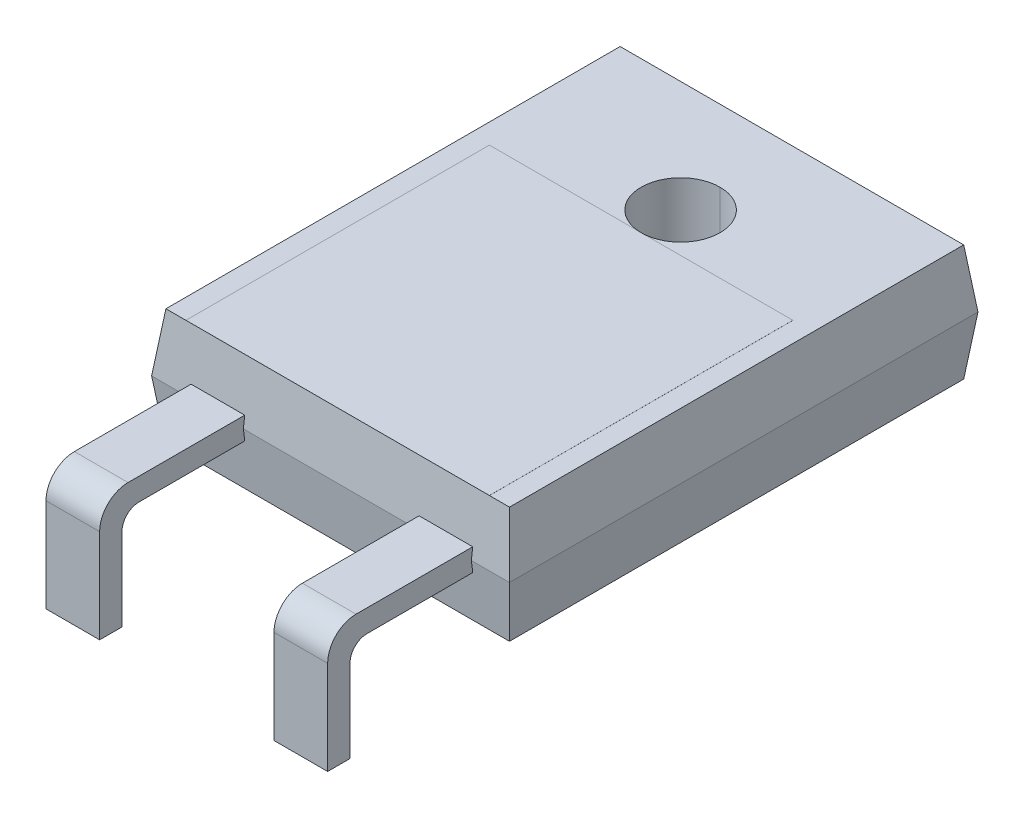
ISO-10303-21;
HEADER;
FILE_DESCRIPTION(('STEP AP214'),'2;1');
FILE_NAME('part.step','',(''),(''),'','','');
FILE_SCHEMA(('AUTOMOTIVE_DESIGN { 1 0 10303 214 1 1 1 1 }'));
ENDSEC;
DATA;
#1=APPLICATION_CONTEXT('core data for automotive mechanical design processes');
#2=APPLICATION_PROTOCOL_DEFINITION('international standard','automotive_design',2000,#1);
#3=PRODUCT_CONTEXT('',#1,'mechanical');
#4=PRODUCT('Part','Part','',(#3));
#5=PRODUCT_RELATED_PRODUCT_CATEGORY('part','',(#4));
#6=PRODUCT_DEFINITION_FORMATION('','',#4);
#7=PRODUCT_DEFINITION_CONTEXT('part definition',#1,'design');
#8=PRODUCT_DEFINITION('design','',#6,#7);
#9=PRODUCT_DEFINITION_SHAPE('','',#8);
#10=(LENGTH_UNIT() NAMED_UNIT(*) SI_UNIT(.MILLI.,.METRE.));
#11=(NAMED_UNIT(*) PLANE_ANGLE_UNIT() SI_UNIT($,.RADIAN.));
#12=(NAMED_UNIT(*) SI_UNIT($,.STERADIAN.) SOLID_ANGLE_UNIT());
#13=UNCERTAINTY_MEASURE_WITH_UNIT(LENGTH_MEASURE(1.E-05),#10,'distance_accuracy_value','');
#14=(GEOMETRIC_REPRESENTATION_CONTEXT(3) GLOBAL_UNCERTAINTY_ASSIGNED_CONTEXT((#13)) GLOBAL_UNIT_ASSIGNED_CONTEXT((#10,
#11,#12)) REPRESENTATION_CONTEXT('',''));
#15=CARTESIAN_POINT('',(0.,0.,0.));
#16=DIRECTION('',(0.,0.,1.));
#17=DIRECTION('',(1.,0.,0.));
#18=AXIS2_PLACEMENT_3D('',#15,#16,#17);
#19=CARTESIAN_POINT('',(0.,2.60254,0.));
#20=DIRECTION('',(0.,-1.,0.));
#21=DIRECTION('',(0.,0.,-1.));
#22=AXIS2_PLACEMENT_3D('',#19,#20,#21);
#23=PLANE('',#22);
#24=DIRECTION('',(0.,0.,-1.));
#25=VECTOR('',#24,1.);
#26=CARTESIAN_POINT('',(6.787880070826,2.60254,10.160760141652));
#27=LINE('',#26,#25);
#28=CARTESIAN_POINT('',(6.787880070826,2.60254,10.160760141652));
#29=VERTEX_POINT('',#28);
#30=CARTESIAN_POINT('',(6.787880070826,2.60254,-3.415));
#31=VERTEX_POINT('',#30);
#32=EDGE_CURVE('E329',#29,#31,#27,.T.);
#33=ORIENTED_EDGE('',*,*,#32,.T.);
#34=DIRECTION('',(-1.,0.,0.));
#35=VECTOR('',#34,1.);
#36=CARTESIAN_POINT('',(-6.787880070826,2.60254,-3.415));
#37=LINE('',#36,#35);
#38=CARTESIAN_POINT('',(-6.787880070826,2.60254,-3.415));
#39=VERTEX_POINT('',#38);
#40=EDGE_CURVE('E290',#31,#39,#37,.T.);
#41=ORIENTED_EDGE('',*,*,#40,.T.);
#42=DIRECTION('',(0.,0.,1.));
#43=VECTOR('',#42,1.);
#44=CARTESIAN_POINT('',(-6.787880070826,2.60254,10.160760141652));
#45=LINE('',#44,#43);
#46=CARTESIAN_POINT('',(-6.787880070826,2.60254,10.160760141652));
#47=VERTEX_POINT('',#46);
#48=EDGE_CURVE('E27',#39,#47,#45,.T.);
#49=ORIENTED_EDGE('',*,*,#48,.T.);
#50=DIRECTION('',(1.,0.,0.));
#51=VECTOR('',#50,1.);
#52=CARTESIAN_POINT('',(-6.787880070826,2.60254,10.160760141652));
#53=LINE('',#52,#51);
#54=EDGE_CURVE('E11',#47,#29,#53,.T.);
#55=ORIENTED_EDGE('',*,*,#54,.T.);
#56=EDGE_LOOP('',(#33,#41,#49,#55));
#57=FACE_BOUND('',#56,.T.);
#58=ADVANCED_FACE('F16',(#57),#23,.F.);
#59=CARTESIAN_POINT('',(-6.787880070826,2.60254,10.160760141652));
#60=DIRECTION('',(0.,0.,-1.));
#61=DIRECTION('',(0.,-1.,0.));
#62=AXIS2_PLACEMENT_3D('',#59,#60,#61);
#63=PLANE('',#62);
#64=DIRECTION('',(1.,0.,0.));
#65=VECTOR('',#64,1.);
#66=CARTESIAN_POINT('',(-6.787880070826,2.6,10.160760141652));
#67=LINE('',#66,#65);
#68=CARTESIAN_POINT('',(-6.787880070826,2.6,10.160760141652));
#69=VERTEX_POINT('',#68);
#70=CARTESIAN_POINT('',(6.787880070826,2.6,10.160760141652));
#71=VERTEX_POINT('',#70);
#72=EDGE_CURVE('E20',#69,#71,#67,.T.);
#73=ORIENTED_EDGE('',*,*,#72,.T.);
#74=DIRECTION('',(0.,-1.,0.));
#75=VECTOR('',#74,1.);
#76=CARTESIAN_POINT('',(6.787880070826,2.60254,10.160760141652));
#77=LINE('',#76,#75);
#78=EDGE_CURVE('E326',#29,#71,#77,.T.);
#79=ORIENTED_EDGE('',*,*,#78,.F.);
#80=ORIENTED_EDGE('',*,*,#54,.F.);
#81=DIRECTION('',(0.,-1.,0.));
#82=VECTOR('',#81,1.);
#83=CARTESIAN_POINT('',(-6.787880070826,2.60254,10.160760141652));
#84=LINE('',#83,#82);
#85=EDGE_CURVE('E294',#47,#69,#84,.T.);
#86=ORIENTED_EDGE('',*,*,#85,.T.);
#87=EDGE_LOOP('',(#73,#79,#80,#86));
#88=FACE_BOUND('',#87,.T.);
#89=ADVANCED_FACE('F560',(#88),#63,.F.);
#90=CARTESIAN_POINT('',(-6.787880070826,2.60254,10.160760141652));
#91=DIRECTION('',(1.,0.,0.));
#92=DIRECTION('',(0.,1.,0.));
#93=AXIS2_PLACEMENT_3D('',#90,#91,#92);
#94=PLANE('',#93);
#95=DIRECTION('',(0.,0.,1.));
#96=VECTOR('',#95,1.);
#97=CARTESIAN_POINT('',(-6.787880070826,2.6,10.160760141652));
#98=LINE('',#97,#96);
#99=CARTESIAN_POINT('',(-6.787880070826,2.6,-3.415));
#100=VERTEX_POINT('',#99);
#101=EDGE_CURVE('E300',#100,#69,#98,.T.);
#102=ORIENTED_EDGE('',*,*,#101,.T.);
#103=ORIENTED_EDGE('',*,*,#85,.F.);
#104=ORIENTED_EDGE('',*,*,#48,.F.);
#105=DIRECTION('',(0.,-1.,0.));
#106=VECTOR('',#105,1.);
#107=CARTESIAN_POINT('',(-6.787880070826,2.60254,-3.415));
#108=LINE('',#107,#106);
#109=EDGE_CURVE('E295',#39,#100,#108,.T.);
#110=ORIENTED_EDGE('',*,*,#109,.T.);
#111=EDGE_LOOP('',(#102,#103,#104,#110));
#112=FACE_BOUND('',#111,.T.);
#113=ADVANCED_FACE('F568',(#112),#94,.F.);
#114=CARTESIAN_POINT('',(-6.787880070826,2.60254,-3.415));
#115=DIRECTION('',(0.,0.,1.));
#116=DIRECTION('',(1.,0.,0.));
#117=AXIS2_PLACEMENT_3D('',#114,#115,#116);
#118=PLANE('',#117);
#119=DIRECTION('',(-1.,0.,0.));
#120=VECTOR('',#119,1.);
#121=CARTESIAN_POINT('',(-6.787880070826,2.6,-3.415));
#122=LINE('',#121,#120);
#123=CARTESIAN_POINT('',(6.787880070826,2.6,-3.415));
#124=VERTEX_POINT('',#123);
#125=CARTESIAN_POINT('',(0.,2.6,-3.415));
#126=VERTEX_POINT('',#125);
#127=EDGE_CURVE('E387',#124,#126,#122,.T.);
#128=ORIENTED_EDGE('',*,*,#127,.T.);
#129=DIRECTION('',(-1.,0.,0.));
#130=VECTOR('',#129,1.);
#131=CARTESIAN_POINT('',(-6.787880070826,2.6,-3.415));
#132=LINE('',#131,#130);
#133=EDGE_CURVE('E386',#126,#100,#132,.T.);
#134=ORIENTED_EDGE('',*,*,#133,.T.);
#135=ORIENTED_EDGE('',*,*,#109,.F.);
#136=ORIENTED_EDGE('',*,*,#40,.F.);
#137=DIRECTION('',(0.,-1.,0.));
#138=VECTOR('',#137,1.);
#139=CARTESIAN_POINT('',(6.787880070826,2.60254,-3.415));
#140=LINE('',#139,#138);
#141=EDGE_CURVE('E392',#31,#124,#140,.T.);
#142=ORIENTED_EDGE('',*,*,#141,.T.);
#143=EDGE_LOOP('',(#128,#134,#135,#136,#142));
#144=FACE_BOUND('',#143,.T.);
#145=ADVANCED_FACE('F747',(#144),#118,.F.);
#146=CARTESIAN_POINT('',(6.787880070826,2.60254,10.160760141652));
#147=DIRECTION('',(-1.,0.,0.));
#148=DIRECTION('',(0.,0.,1.));
#149=AXIS2_PLACEMENT_3D('',#146,#147,#148);
#150=PLANE('',#149);
#151=DIRECTION('',(0.,0.,-1.));
#152=VECTOR('',#151,1.);
#153=CARTESIAN_POINT('',(6.787880070826,2.6,10.160760141652));
#154=LINE('',#153,#152);
#155=EDGE_CURVE('E378',#71,#124,#154,.T.);
#156=ORIENTED_EDGE('',*,*,#155,.T.);
#157=ORIENTED_EDGE('',*,*,#141,.F.);
#158=ORIENTED_EDGE('',*,*,#32,.F.);
#159=ORIENTED_EDGE('',*,*,#78,.T.);
#160=EDGE_LOOP('',(#156,#157,#158,#159));
#161=FACE_BOUND('',#160,.T.);
#162=ADVANCED_FACE('F758',(#161),#150,.F.);
#163=CARTESIAN_POINT('',(-6.29999996,-0.77,15.64));
#164=DIRECTION('',(-1.,0.,0.));
#165=DIRECTION('',(0.,0.,1.));
#166=AXIS2_PLACEMENT_3D('',#163,#164,#165);
#167=PLANE('',#166);
#168=DIRECTION('',(0.,0.992546151641335,-0.121869343405041));
#169=VECTOR('',#168,1.);
#170=CARTESIAN_POINT('',(-6.29999996,0.,10.48));
#171=LINE('',#170,#169);
#172=CARTESIAN_POINT('',(-6.29999996,0.,10.48));
#173=VERTEX_POINT('',#172);
#174=CARTESIAN_POINT('',(-6.29999996,0.5,10.418607719549));
#175=VERTEX_POINT('',#174);
#176=EDGE_CURVE('E355',#173,#175,#171,.T.);
#177=ORIENTED_EDGE('',*,*,#176,.F.);
#178=DIRECTION('',(0.,-0.992546151641335,-0.121869343405041));
#179=VECTOR('',#178,1.);
#180=CARTESIAN_POINT('',(-6.29999996,0.,10.48));
#181=LINE('',#180,#179);
#182=CARTESIAN_POINT('',(-6.29999996,-0.5,10.418607719549));
#183=VERTEX_POINT('',#182);
#184=EDGE_CURVE('E441',#173,#183,#181,.T.);
#185=ORIENTED_EDGE('',*,*,#184,.T.);
#186=DIRECTION('',(0.,0.,-1.));
#187=VECTOR('',#186,1.);
#188=CARTESIAN_POINT('',(-6.29999996,-0.5,15.148));
#189=LINE('',#188,#187);
#190=CARTESIAN_POINT('',(-6.29999996,-0.5,15.148));
#191=VERTEX_POINT('',#190);
#192=EDGE_CURVE('E342',#191,#183,#189,.T.);
#193=ORIENTED_EDGE('',*,*,#192,.F.);
#194=CARTESIAN_POINT('',(-6.29999996,-1.262,15.148));
#195=DIRECTION('',(-1.,0.,0.));
#196=DIRECTION('',(0.,0.,1.));
#197=AXIS2_PLACEMENT_3D('',#194,#195,#196);
#198=CIRCLE('',#197,0.762);
#199=CARTESIAN_POINT('',(-6.29999996,-1.262,15.91));
#200=VERTEX_POINT('',#199);
#201=EDGE_CURVE('E373',#200,#191,#198,.T.);
#202=ORIENTED_EDGE('',*,*,#201,.F.);
#203=DIRECTION('',(0.,1.,0.));
#204=VECTOR('',#203,1.);
#205=CARTESIAN_POINT('',(-6.29999996,-4.961,15.91));
#206=LINE('',#205,#204);
#207=CARTESIAN_POINT('',(-6.29999996,-4.961,15.91));
#208=VERTEX_POINT('',#207);
#209=EDGE_CURVE('E532',#208,#200,#206,.T.);
#210=ORIENTED_EDGE('',*,*,#209,.F.);
#211=DIRECTION('',(0.,0.,-1.));
#212=VECTOR('',#211,1.);
#213=CARTESIAN_POINT('',(-6.29999996,-4.961,16.91));
#214=LINE('',#213,#212);
#215=CARTESIAN_POINT('',(-6.29999996,-4.961,16.91));
#216=VERTEX_POINT('',#215);
#217=EDGE_CURVE('E474',#216,#208,#214,.T.);
#218=ORIENTED_EDGE('',*,*,#217,.F.);
#219=DIRECTION('',(0.,-1.,0.));
#220=VECTOR('',#219,1.);
#221=CARTESIAN_POINT('',(-6.29999996,-0.77,16.91));
#222=LINE('',#221,#220);
#223=CARTESIAN_POINT('',(-6.29999996,-0.77,16.91));
#224=VERTEX_POINT('',#223);
#225=EDGE_CURVE('E353',#224,#216,#222,.T.);
#226=ORIENTED_EDGE('',*,*,#225,.F.);
#227=CARTESIAN_POINT('',(-6.29999996,-0.77,15.64));
#228=DIRECTION('',(1.,0.,0.));
#229=DIRECTION('',(0.,0.,-1.));
#230=AXIS2_PLACEMENT_3D('',#227,#228,#229);
#231=CIRCLE('',#230,1.27);
#232=CARTESIAN_POINT('',(-6.29999996,0.5,15.64));
#233=VERTEX_POINT('',#232);
#234=EDGE_CURVE('E288',#233,#224,#231,.T.);
#235=ORIENTED_EDGE('',*,*,#234,.F.);
#236=DIRECTION('',(0.,0.,1.));
#237=VECTOR('',#236,1.);
#238=CARTESIAN_POINT('',(-6.29999996,0.5,10.226));
#239=LINE('',#238,#237);
#240=EDGE_CURVE('E289',#175,#233,#239,.T.);
#241=ORIENTED_EDGE('',*,*,#240,.F.);
#242=EDGE_LOOP('',(#177,#185,#193,#202,#210,#218,#226,#235,#241));
#243=FACE_BOUND('',#242,.T.);
#244=ADVANCED_FACE('F770',(#243),#167,.T.);
#245=CARTESIAN_POINT('',(-3.89999996,-0.77,15.64));
#246=DIRECTION('',(-1.,0.,0.));
#247=DIRECTION('',(0.,0.,1.));
#248=AXIS2_PLACEMENT_3D('',#245,#246,#247);
#249=PLANE('',#248);
#250=DIRECTION('',(0.,-0.992546151641335,-0.121869343405041));
#251=VECTOR('',#250,1.);
#252=CARTESIAN_POINT('',(-3.89999996,0.,10.48));
#253=LINE('',#252,#251);
#254=CARTESIAN_POINT('',(-3.89999996,0.,10.48));
#255=VERTEX_POINT('',#254);
#256=CARTESIAN_POINT('',(-3.89999996,-0.5,10.418607719549));
#257=VERTEX_POINT('',#256);
#258=EDGE_CURVE('E483',#255,#257,#253,.T.);
#259=ORIENTED_EDGE('',*,*,#258,.F.);
#260=DIRECTION('',(0.,0.992546151641335,-0.121869343405041));
#261=VECTOR('',#260,1.);
#262=CARTESIAN_POINT('',(-3.89999996,0.,10.48));
#263=LINE('',#262,#261);
#264=CARTESIAN_POINT('',(-3.89999996,0.5,10.418607719549));
#265=VERTEX_POINT('',#264);
#266=EDGE_CURVE('E469',#255,#265,#263,.T.);
#267=ORIENTED_EDGE('',*,*,#266,.T.);
#268=DIRECTION('',(0.,0.,1.));
#269=VECTOR('',#268,1.);
#270=CARTESIAN_POINT('',(-3.89999996,0.5,10.226));
#271=LINE('',#270,#269);
#272=CARTESIAN_POINT('',(-3.89999996,0.5,15.64));
#273=VERTEX_POINT('',#272);
#274=EDGE_CURVE('E247',#265,#273,#271,.T.);
#275=ORIENTED_EDGE('',*,*,#274,.T.);
#276=CARTESIAN_POINT('',(-3.89999996,-0.77,15.64));
#277=DIRECTION('',(1.,0.,0.));
#278=DIRECTION('',(0.,0.,-1.));
#279=AXIS2_PLACEMENT_3D('',#276,#277,#278);
#280=CIRCLE('',#279,1.27);
#281=CARTESIAN_POINT('',(-3.89999996,-0.77,16.91));
#282=VERTEX_POINT('',#281);
#283=EDGE_CURVE('E349',#273,#282,#280,.T.);
#284=ORIENTED_EDGE('',*,*,#283,.T.);
#285=DIRECTION('',(0.,-1.,0.));
#286=VECTOR('',#285,1.);
#287=CARTESIAN_POINT('',(-3.89999996,-0.77,16.91));
#288=LINE('',#287,#286);
#289=CARTESIAN_POINT('',(-3.89999996,-4.961,16.91));
#290=VERTEX_POINT('',#289);
#291=EDGE_CURVE('E479',#282,#290,#288,.T.);
#292=ORIENTED_EDGE('',*,*,#291,.T.);
#293=DIRECTION('',(0.,0.,-1.));
#294=VECTOR('',#293,1.);
#295=CARTESIAN_POINT('',(-3.89999996,-4.961,16.91));
#296=LINE('',#295,#294);
#297=CARTESIAN_POINT('',(-3.89999996,-4.961,15.91));
#298=VERTEX_POINT('',#297);
#299=EDGE_CURVE('E521',#290,#298,#296,.T.);
#300=ORIENTED_EDGE('',*,*,#299,.T.);
#301=DIRECTION('',(0.,1.,0.));
#302=VECTOR('',#301,1.);
#303=CARTESIAN_POINT('',(-3.89999996,-4.961,15.91));
#304=LINE('',#303,#302);
#305=CARTESIAN_POINT('',(-3.89999996,-1.262,15.91));
#306=VERTEX_POINT('',#305);
#307=EDGE_CURVE('E369',#298,#306,#304,.T.);
#308=ORIENTED_EDGE('',*,*,#307,.T.);
#309=CARTESIAN_POINT('',(-3.89999996,-1.262,15.148));
#310=DIRECTION('',(-1.,0.,0.));
#311=DIRECTION('',(0.,0.,1.));
#312=AXIS2_PLACEMENT_3D('',#309,#310,#311);
#313=CIRCLE('',#312,0.762);
#314=CARTESIAN_POINT('',(-3.89999996,-0.5,15.148));
#315=VERTEX_POINT('',#314);
#316=EDGE_CURVE('E343',#306,#315,#313,.T.);
#317=ORIENTED_EDGE('',*,*,#316,.T.);
#318=DIRECTION('',(0.,0.,-1.));
#319=VECTOR('',#318,1.);
#320=CARTESIAN_POINT('',(-3.89999996,-0.5,15.148));
#321=LINE('',#320,#319);
#322=EDGE_CURVE('E338',#315,#257,#321,.T.);
#323=ORIENTED_EDGE('',*,*,#322,.T.);
#324=EDGE_LOOP('',(#259,#267,#275,#284,#292,#300,#308,#317,#323));
#325=FACE_BOUND('',#324,.T.);
#326=ADVANCED_FACE('F1030',(#325),#249,.F.);
#327=CARTESIAN_POINT('',(-3.89999996,-0.5,15.148));
#328=DIRECTION('',(0.,1.,0.));
#329=DIRECTION('',(1.,0.,0.));
#330=AXIS2_PLACEMENT_3D('',#327,#328,#329);
#331=PLANE('',#330);
#332=DIRECTION('',(-1.,0.,0.));
#333=VECTOR('',#332,1.);
#334=CARTESIAN_POINT('',(-8.005,-0.5,10.418607719549));
#335=LINE('',#334,#333);
#336=EDGE_CURVE('E446',#257,#183,#335,.T.);
#337=ORIENTED_EDGE('',*,*,#336,.F.);
#338=ORIENTED_EDGE('',*,*,#322,.F.);
#339=DIRECTION('',(-1.,0.,0.));
#340=VECTOR('',#339,1.);
#341=CARTESIAN_POINT('',(-3.89999996,-0.5,15.148));
#342=LINE('',#341,#340);
#343=EDGE_CURVE('E398',#315,#191,#342,.T.);
#344=ORIENTED_EDGE('',*,*,#343,.T.);
#345=ORIENTED_EDGE('',*,*,#192,.T.);
#346=EDGE_LOOP('',(#337,#338,#344,#345));
#347=FACE_BOUND('',#346,.T.);
#348=ADVANCED_FACE('F1022',(#347),#331,.F.);
#349=CARTESIAN_POINT('',(-3.89999996,-1.262,15.148));
#350=DIRECTION('',(-1.,0.,0.));
#351=DIRECTION('',(0.,0.,1.));
#352=AXIS2_PLACEMENT_3D('',#349,#350,#351);
#353=CYLINDRICAL_SURFACE('',#352,0.762);
#354=DIRECTION('',(-1.,0.,0.));
#355=VECTOR('',#354,1.);
#356=CARTESIAN_POINT('',(-3.89999996,-1.262,15.91));
#357=LINE('',#356,#355);
#358=EDGE_CURVE('E272',#306,#200,#357,.T.);
#359=ORIENTED_EDGE('',*,*,#358,.T.);
#360=ORIENTED_EDGE('',*,*,#201,.T.);
#361=ORIENTED_EDGE('',*,*,#343,.F.);
#362=ORIENTED_EDGE('',*,*,#316,.F.);
#363=EDGE_LOOP('',(#359,#360,#361,#362));
#364=FACE_BOUND('',#363,.T.);
#365=ADVANCED_FACE('F1014',(#364),#353,.F.);
#366=CARTESIAN_POINT('',(-3.89999996,-4.961,15.91));
#367=DIRECTION('',(0.,0.,1.));
#368=DIRECTION('',(1.,0.,0.));
#369=AXIS2_PLACEMENT_3D('',#366,#367,#368);
#370=PLANE('',#369);
#371=DIRECTION('',(-1.,0.,0.));
#372=VECTOR('',#371,1.);
#373=CARTESIAN_POINT('',(-3.89999996,-4.961,15.91));
#374=LINE('',#373,#372);
#375=EDGE_CURVE('E478',#298,#208,#374,.T.);
#376=ORIENTED_EDGE('',*,*,#375,.T.);
#377=ORIENTED_EDGE('',*,*,#209,.T.);
#378=ORIENTED_EDGE('',*,*,#358,.F.);
#379=ORIENTED_EDGE('',*,*,#307,.F.);
#380=EDGE_LOOP('',(#376,#377,#378,#379));
#381=FACE_BOUND('',#380,.T.);
#382=ADVANCED_FACE('F1006',(#381),#370,.F.);
#383=CARTESIAN_POINT('',(-3.89999996,-4.961,16.91));
#384=DIRECTION('',(0.,1.,0.));
#385=DIRECTION('',(1.,0.,0.));
#386=AXIS2_PLACEMENT_3D('',#383,#384,#385);
#387=PLANE('',#386);
#388=DIRECTION('',(-1.,0.,0.));
#389=VECTOR('',#388,1.);
#390=CARTESIAN_POINT('',(-3.89999996,-4.961,16.91));
#391=LINE('',#390,#389);
#392=EDGE_CURVE('E503',#290,#216,#391,.T.);
#393=ORIENTED_EDGE('',*,*,#392,.T.);
#394=ORIENTED_EDGE('',*,*,#217,.T.);
#395=ORIENTED_EDGE('',*,*,#375,.F.);
#396=ORIENTED_EDGE('',*,*,#299,.F.);
#397=EDGE_LOOP('',(#393,#394,#395,#396));
#398=FACE_BOUND('',#397,.T.);
#399=ADVANCED_FACE('F998',(#398),#387,.F.);
#400=CARTESIAN_POINT('',(-3.89999996,-0.77,16.91));
#401=DIRECTION('',(0.,0.,-1.));
#402=DIRECTION('',(0.,-1.,0.));
#403=AXIS2_PLACEMENT_3D('',#400,#401,#402);
#404=PLANE('',#403);
#405=DIRECTION('',(-1.,0.,0.));
#406=VECTOR('',#405,1.);
#407=CARTESIAN_POINT('',(-3.89999996,-0.77,16.91));
#408=LINE('',#407,#406);
#409=EDGE_CURVE('E354',#282,#224,#408,.T.);
#410=ORIENTED_EDGE('',*,*,#409,.T.);
#411=ORIENTED_EDGE('',*,*,#225,.T.);
#412=ORIENTED_EDGE('',*,*,#392,.F.);
#413=ORIENTED_EDGE('',*,*,#291,.F.);
#414=EDGE_LOOP('',(#410,#411,#412,#413));
#415=FACE_BOUND('',#414,.T.);
#416=ADVANCED_FACE('F990',(#415),#404,.F.);
#417=CARTESIAN_POINT('',(-3.89999996,-0.77,15.64));
#418=DIRECTION('',(-1.,0.,0.));
#419=DIRECTION('',(0.,0.,1.));
#420=AXIS2_PLACEMENT_3D('',#417,#418,#419);
#421=CYLINDRICAL_SURFACE('',#420,1.27);
#422=DIRECTION('',(-1.,0.,0.));
#423=VECTOR('',#422,1.);
#424=CARTESIAN_POINT('',(-3.89999996,0.5,15.64));
#425=LINE('',#424,#423);
#426=EDGE_CURVE('E284',#273,#233,#425,.T.);
#427=ORIENTED_EDGE('',*,*,#426,.T.);
#428=ORIENTED_EDGE('',*,*,#234,.T.);
#429=ORIENTED_EDGE('',*,*,#409,.F.);
#430=ORIENTED_EDGE('',*,*,#283,.F.);
#431=EDGE_LOOP('',(#427,#428,#429,#430));
#432=FACE_BOUND('',#431,.T.);
#433=ADVANCED_FACE('F982',(#432),#421,.T.);
#434=CARTESIAN_POINT('',(-3.89999996,0.5,10.226));
#435=DIRECTION('',(0.,-1.,0.));
#436=DIRECTION('',(0.,0.,-1.));
#437=AXIS2_PLACEMENT_3D('',#434,#435,#436);
#438=PLANE('',#437);
#439=ORIENTED_EDGE('',*,*,#274,.F.);
#440=DIRECTION('',(-1.,0.,0.));
#441=VECTOR('',#440,1.);
#442=CARTESIAN_POINT('',(-8.005,0.5,10.418607719549));
#443=LINE('',#442,#441);
#444=EDGE_CURVE('E278',#265,#175,#443,.T.);
#445=ORIENTED_EDGE('',*,*,#444,.T.);
#446=ORIENTED_EDGE('',*,*,#240,.T.);
#447=ORIENTED_EDGE('',*,*,#426,.F.);
#448=EDGE_LOOP('',(#439,#445,#446,#447));
#449=FACE_BOUND('',#448,.T.);
#450=ADVANCED_FACE('F975',(#449),#438,.F.);
#451=CARTESIAN_POINT('',(6.29999996,-0.77,15.64));
#452=DIRECTION('',(1.,0.,0.));
#453=DIRECTION('',(0.,1.,0.));
#454=AXIS2_PLACEMENT_3D('',#451,#452,#453);
#455=PLANE('',#454);
#456=DIRECTION('',(0.,0.,-1.));
#457=VECTOR('',#456,1.);
#458=CARTESIAN_POINT('',(6.29999996,-0.5,15.148));
#459=LINE('',#458,#457);
#460=CARTESIAN_POINT('',(6.29999996,-0.5,15.148));
#461=VERTEX_POINT('',#460);
#462=CARTESIAN_POINT('',(6.29999996,-0.5,10.418607719549));
#463=VERTEX_POINT('',#462);
#464=EDGE_CURVE('E325',#461,#463,#459,.T.);
#465=ORIENTED_EDGE('',*,*,#464,.T.);
#466=DIRECTION('',(0.,0.992546151641335,0.121869343405041));
#467=VECTOR('',#466,1.);
#468=CARTESIAN_POINT('',(6.29999996,0.,10.48));
#469=LINE('',#468,#467);
#470=CARTESIAN_POINT('',(6.29999996,0.,10.48));
#471=VERTEX_POINT('',#470);
#472=EDGE_CURVE('E364',#463,#471,#469,.T.);
#473=ORIENTED_EDGE('',*,*,#472,.T.);
#474=DIRECTION('',(0.,-0.992546151641335,0.121869343405041));
#475=VECTOR('',#474,1.);
#476=CARTESIAN_POINT('',(6.29999996,0.,10.48));
#477=LINE('',#476,#475);
#478=CARTESIAN_POINT('',(6.29999996,0.5,10.418607719549));
#479=VERTEX_POINT('',#478);
#480=EDGE_CURVE('E498',#479,#471,#477,.T.);
#481=ORIENTED_EDGE('',*,*,#480,.F.);
#482=DIRECTION('',(0.,0.,1.));
#483=VECTOR('',#482,1.);
#484=CARTESIAN_POINT('',(6.29999996,0.5,10.226));
#485=LINE('',#484,#483);
#486=CARTESIAN_POINT('',(6.29999996,0.5,15.64));
#487=VERTEX_POINT('',#486);
#488=EDGE_CURVE('E317',#479,#487,#485,.T.);
#489=ORIENTED_EDGE('',*,*,#488,.T.);
#490=CARTESIAN_POINT('',(6.29999996,-0.77,15.64));
#491=DIRECTION('',(1.,0.,0.));
#492=DIRECTION('',(0.,0.,-1.));
#493=AXIS2_PLACEMENT_3D('',#490,#491,#492);
#494=CIRCLE('',#493,1.27);
#495=CARTESIAN_POINT('',(6.29999996,-0.77,16.91));
#496=VERTEX_POINT('',#495);
#497=EDGE_CURVE('E248',#487,#496,#494,.T.);
#498=ORIENTED_EDGE('',*,*,#497,.T.);
#499=DIRECTION('',(0.,-1.,0.));
#500=VECTOR('',#499,1.);
#501=CARTESIAN_POINT('',(6.29999996,-0.77,16.91));
#502=LINE('',#501,#500);
#503=CARTESIAN_POINT('',(6.29999996,-4.961,16.91));
#504=VERTEX_POINT('',#503);
#505=EDGE_CURVE('E262',#496,#504,#502,.T.);
#506=ORIENTED_EDGE('',*,*,#505,.T.);
#507=DIRECTION('',(0.,0.,-1.));
#508=VECTOR('',#507,1.);
#509=CARTESIAN_POINT('',(6.29999996,-4.961,16.91));
#510=LINE('',#509,#508);
#511=CARTESIAN_POINT('',(6.29999996,-4.961,15.91));
#512=VERTEX_POINT('',#511);
#513=EDGE_CURVE('E382',#504,#512,#510,.T.);
#514=ORIENTED_EDGE('',*,*,#513,.T.);
#515=DIRECTION('',(0.,1.,0.));
#516=VECTOR('',#515,1.);
#517=CARTESIAN_POINT('',(6.29999996,-4.961,15.91));
#518=LINE('',#517,#516);
#519=CARTESIAN_POINT('',(6.29999996,-1.262,15.91));
#520=VERTEX_POINT('',#519);
#521=EDGE_CURVE('E282',#512,#520,#518,.T.);
#522=ORIENTED_EDGE('',*,*,#521,.T.);
#523=CARTESIAN_POINT('',(6.29999996,-1.262,15.148));
#524=DIRECTION('',(-1.,0.,0.));
#525=DIRECTION('',(0.,0.,1.));
#526=AXIS2_PLACEMENT_3D('',#523,#524,#525);
#527=CIRCLE('',#526,0.762);
#528=EDGE_CURVE('E362',#520,#461,#527,.T.);
#529=ORIENTED_EDGE('',*,*,#528,.T.);
#530=EDGE_LOOP('',(#465,#473,#481,#489,#498,#506,#514,#522,#529));
#531=FACE_BOUND('',#530,.T.);
#532=ADVANCED_FACE('F634',(#531),#455,.T.);
#533=CARTESIAN_POINT('',(3.89999996,-0.77,15.64));
#534=DIRECTION('',(1.,0.,0.));
#535=DIRECTION('',(0.,1.,0.));
#536=AXIS2_PLACEMENT_3D('',#533,#534,#535);
#537=PLANE('',#536);
#538=DIRECTION('',(0.,0.992546151641335,0.121869343405041));
#539=VECTOR('',#538,1.);
#540=CARTESIAN_POINT('',(3.89999996,0.,10.48));
#541=LINE('',#540,#539);
#542=CARTESIAN_POINT('',(3.89999996,-0.5,10.418607719549));
#543=VERTEX_POINT('',#542);
#544=CARTESIAN_POINT('',(3.89999996,0.,10.48));
#545=VERTEX_POINT('',#544);
#546=EDGE_CURVE('E440',#543,#545,#541,.T.);
#547=ORIENTED_EDGE('',*,*,#546,.F.);
#548=DIRECTION('',(0.,0.,-1.));
#549=VECTOR('',#548,1.);
#550=CARTESIAN_POINT('',(3.89999996,-0.5,15.148));
#551=LINE('',#550,#549);
#552=CARTESIAN_POINT('',(3.89999996,-0.5,15.148));
#553=VERTEX_POINT('',#552);
#554=EDGE_CURVE('E321',#553,#543,#551,.T.);
#555=ORIENTED_EDGE('',*,*,#554,.F.);
#556=CARTESIAN_POINT('',(3.89999996,-1.262,15.148));
#557=DIRECTION('',(-1.,0.,0.));
#558=DIRECTION('',(0.,0.,1.));
#559=AXIS2_PLACEMENT_3D('',#556,#557,#558);
#560=CIRCLE('',#559,0.762);
#561=CARTESIAN_POINT('',(3.89999996,-1.262,15.91));
#562=VERTEX_POINT('',#561);
#563=EDGE_CURVE('E279',#562,#553,#560,.T.);
#564=ORIENTED_EDGE('',*,*,#563,.F.);
#565=DIRECTION('',(0.,1.,0.));
#566=VECTOR('',#565,1.);
#567=CARTESIAN_POINT('',(3.89999996,-4.961,15.91));
#568=LINE('',#567,#566);
#569=CARTESIAN_POINT('',(3.89999996,-4.961,15.91));
#570=VERTEX_POINT('',#569);
#571=EDGE_CURVE('E348',#570,#562,#568,.T.);
#572=ORIENTED_EDGE('',*,*,#571,.F.);
#573=DIRECTION('',(0.,0.,-1.));
#574=VECTOR('',#573,1.);
#575=CARTESIAN_POINT('',(3.89999996,-4.961,16.91));
#576=LINE('',#575,#574);
#577=CARTESIAN_POINT('',(3.89999996,-4.961,16.91));
#578=VERTEX_POINT('',#577);
#579=EDGE_CURVE('E255',#578,#570,#576,.T.);
#580=ORIENTED_EDGE('',*,*,#579,.F.);
#581=DIRECTION('',(0.,-1.,0.));
#582=VECTOR('',#581,1.);
#583=CARTESIAN_POINT('',(3.89999996,-0.77,16.91));
#584=LINE('',#583,#582);
#585=CARTESIAN_POINT('',(3.89999996,-0.77,16.91));
#586=VERTEX_POINT('',#585);
#587=EDGE_CURVE('E251',#586,#578,#584,.T.);
#588=ORIENTED_EDGE('',*,*,#587,.F.);
#589=CARTESIAN_POINT('',(3.89999996,-0.77,15.64));
#590=DIRECTION('',(1.,0.,0.));
#591=DIRECTION('',(0.,0.,-1.));
#592=AXIS2_PLACEMENT_3D('',#589,#590,#591);
#593=CIRCLE('',#592,1.27);
#594=CARTESIAN_POINT('',(3.89999996,0.5,15.64));
#595=VERTEX_POINT('',#594);
#596=EDGE_CURVE('E199',#595,#586,#593,.T.);
#597=ORIENTED_EDGE('',*,*,#596,.F.);
#598=DIRECTION('',(0.,0.,1.));
#599=VECTOR('',#598,1.);
#600=CARTESIAN_POINT('',(3.89999996,0.5,10.226));
#601=LINE('',#600,#599);
#602=CARTESIAN_POINT('',(3.89999996,0.5,10.418607719549));
#603=VERTEX_POINT('',#602);
#604=EDGE_CURVE('E409',#603,#595,#601,.T.);
#605=ORIENTED_EDGE('',*,*,#604,.F.);
#606=DIRECTION('',(0.,-0.992546151641335,0.121869343405041));
#607=VECTOR('',#606,1.);
#608=CARTESIAN_POINT('',(3.89999996,0.,10.48));
#609=LINE('',#608,#607);
#610=EDGE_CURVE('E473',#603,#545,#609,.T.);
#611=ORIENTED_EDGE('',*,*,#610,.T.);
#612=EDGE_LOOP('',(#547,#555,#564,#572,#580,#588,#597,#605,#611));
#613=FACE_BOUND('',#612,.T.);
#614=ADVANCED_FACE('F253',(#613),#537,.F.);
#615=CARTESIAN_POINT('',(3.89999996,-0.77,15.64));
#616=DIRECTION('',(1.,0.,0.));
#617=DIRECTION('',(0.,0.,-1.));
#618=AXIS2_PLACEMENT_3D('',#615,#616,#617);
#619=CYLINDRICAL_SURFACE('',#618,1.27);
#620=DIRECTION('',(1.,0.,0.));
#621=VECTOR('',#620,1.);
#622=CARTESIAN_POINT('',(3.89999996,-0.77,16.91));
#623=LINE('',#622,#621);
#624=EDGE_CURVE('E241',#586,#496,#623,.T.);
#625=ORIENTED_EDGE('',*,*,#624,.T.);
#626=ORIENTED_EDGE('',*,*,#497,.F.);
#627=DIRECTION('',(1.,0.,0.));
#628=VECTOR('',#627,1.);
#629=CARTESIAN_POINT('',(3.89999996,0.5,15.64));
#630=LINE('',#629,#628);
#631=EDGE_CURVE('E244',#595,#487,#630,.T.);
#632=ORIENTED_EDGE('',*,*,#631,.F.);
#633=ORIENTED_EDGE('',*,*,#596,.T.);
#634=EDGE_LOOP('',(#625,#626,#632,#633));
#635=FACE_BOUND('',#634,.T.);
#636=ADVANCED_FACE('F239',(#635),#619,.T.);
#637=CARTESIAN_POINT('',(3.89999996,-0.77,16.91));
#638=DIRECTION('',(0.,0.,1.));
#639=DIRECTION('',(1.,0.,0.));
#640=AXIS2_PLACEMENT_3D('',#637,#638,#639);
#641=PLANE('',#640);
#642=DIRECTION('',(1.,0.,0.));
#643=VECTOR('',#642,1.);
#644=CARTESIAN_POINT('',(3.89999996,-4.961,16.91));
#645=LINE('',#644,#643);
#646=EDGE_CURVE('E379',#578,#504,#645,.T.);
#647=ORIENTED_EDGE('',*,*,#646,.T.);
#648=ORIENTED_EDGE('',*,*,#505,.F.);
#649=ORIENTED_EDGE('',*,*,#624,.F.);
#650=ORIENTED_EDGE('',*,*,#587,.T.);
#651=EDGE_LOOP('',(#647,#648,#649,#650));
#652=FACE_BOUND('',#651,.T.);
#653=ADVANCED_FACE('F18',(#652),#641,.T.);
#654=CARTESIAN_POINT('',(3.89999996,-4.961,16.91));
#655=DIRECTION('',(0.,-1.,0.));
#656=DIRECTION('',(0.,0.,-1.));
#657=AXIS2_PLACEMENT_3D('',#654,#655,#656);
#658=PLANE('',#657);
#659=DIRECTION('',(1.,0.,0.));
#660=VECTOR('',#659,1.);
#661=CARTESIAN_POINT('',(3.89999996,-4.961,15.91));
#662=LINE('',#661,#660);
#663=EDGE_CURVE('E344',#570,#512,#662,.T.);
#664=ORIENTED_EDGE('',*,*,#663,.T.);
#665=ORIENTED_EDGE('',*,*,#513,.F.);
#666=ORIENTED_EDGE('',*,*,#646,.F.);
#667=ORIENTED_EDGE('',*,*,#579,.T.);
#668=EDGE_LOOP('',(#664,#665,#666,#667));
#669=FACE_BOUND('',#668,.T.);
#670=ADVANCED_FACE('F680',(#669),#658,.T.);
#671=CARTESIAN_POINT('',(3.89999996,-4.961,15.91));
#672=DIRECTION('',(0.,0.,-1.));
#673=DIRECTION('',(0.,-1.,0.));
#674=AXIS2_PLACEMENT_3D('',#671,#672,#673);
#675=PLANE('',#674);
#676=DIRECTION('',(1.,0.,0.));
#677=VECTOR('',#676,1.);
#678=CARTESIAN_POINT('',(3.89999996,-1.262,15.91));
#679=LINE('',#678,#677);
#680=EDGE_CURVE('E283',#562,#520,#679,.T.);
#681=ORIENTED_EDGE('',*,*,#680,.T.);
#682=ORIENTED_EDGE('',*,*,#521,.F.);
#683=ORIENTED_EDGE('',*,*,#663,.F.);
#684=ORIENTED_EDGE('',*,*,#571,.T.);
#685=EDGE_LOOP('',(#681,#682,#683,#684));
#686=FACE_BOUND('',#685,.T.);
#687=ADVANCED_FACE('F682',(#686),#675,.T.);
#688=CARTESIAN_POINT('',(3.89999996,-1.262,15.148));
#689=DIRECTION('',(1.,0.,0.));
#690=DIRECTION('',(0.,0.,-1.));
#691=AXIS2_PLACEMENT_3D('',#688,#689,#690);
#692=CYLINDRICAL_SURFACE('',#691,0.762);
#693=DIRECTION('',(1.,0.,0.));
#694=VECTOR('',#693,1.);
#695=CARTESIAN_POINT('',(3.89999996,-0.5,15.148));
#696=LINE('',#695,#694);
#697=EDGE_CURVE('E333',#553,#461,#696,.T.);
#698=ORIENTED_EDGE('',*,*,#697,.T.);
#699=ORIENTED_EDGE('',*,*,#528,.F.);
#700=ORIENTED_EDGE('',*,*,#680,.F.);
#701=ORIENTED_EDGE('',*,*,#563,.T.);
#702=EDGE_LOOP('',(#698,#699,#700,#701));
#703=FACE_BOUND('',#702,.T.);
#704=ADVANCED_FACE('F687',(#703),#692,.F.);
#705=CARTESIAN_POINT('',(3.89999996,-0.5,15.148));
#706=DIRECTION('',(0.,-1.,0.));
#707=DIRECTION('',(0.,0.,-1.));
#708=AXIS2_PLACEMENT_3D('',#705,#706,#707);
#709=PLANE('',#708);
#710=ORIENTED_EDGE('',*,*,#554,.T.);
#711=DIRECTION('',(1.,0.,0.));
#712=VECTOR('',#711,1.);
#713=CARTESIAN_POINT('',(-8.005,-0.5,10.418607719549));
#714=LINE('',#713,#712);
#715=EDGE_CURVE('E368',#543,#463,#714,.T.);
#716=ORIENTED_EDGE('',*,*,#715,.T.);
#717=ORIENTED_EDGE('',*,*,#464,.F.);
#718=ORIENTED_EDGE('',*,*,#697,.F.);
#719=EDGE_LOOP('',(#710,#716,#717,#718));
#720=FACE_BOUND('',#719,.T.);
#721=ADVANCED_FACE('F927',(#720),#709,.T.);
#722=CARTESIAN_POINT('',(3.89999996,0.5,10.226));
#723=DIRECTION('',(0.,1.,0.));
#724=DIRECTION('',(0.,0.,-1.));
#725=AXIS2_PLACEMENT_3D('',#722,#723,#724);
#726=PLANE('',#725);
#727=DIRECTION('',(1.,0.,0.));
#728=VECTOR('',#727,1.);
#729=CARTESIAN_POINT('',(-8.005,0.5,10.418607719549));
#730=LINE('',#729,#728);
#731=EDGE_CURVE('E502',#603,#479,#730,.T.);
#732=ORIENTED_EDGE('',*,*,#731,.F.);
#733=ORIENTED_EDGE('',*,*,#604,.T.);
#734=ORIENTED_EDGE('',*,*,#631,.T.);
#735=ORIENTED_EDGE('',*,*,#488,.F.);
#736=EDGE_LOOP('',(#732,#733,#734,#735));
#737=FACE_BOUND('',#736,.T.);
#738=ADVANCED_FACE('F785',(#737),#726,.T.);
#739=CARTESIAN_POINT('',(0.,2.6,-5.18));
#740=DIRECTION('',(0.,-1.,0.));
#741=DIRECTION('',(0.,0.,-1.));
#742=AXIS2_PLACEMENT_3D('',#739,#740,#741);
#743=CYLINDRICAL_SURFACE('',#742,1.765);
#744=DIRECTION('',(0.,-1.,0.));
#745=VECTOR('',#744,1.);
#746=CARTESIAN_POINT('',(0.,2.6,-3.415));
#747=LINE('',#746,#745);
#748=CARTESIAN_POINT('',(0.,-2.6,-3.415));
#749=VERTEX_POINT('',#748);
#750=EDGE_CURVE('E311',#126,#749,#747,.T.);
#751=ORIENTED_EDGE('',*,*,#750,.F.);
#752=CARTESIAN_POINT('',(0.,2.6,-5.18));
#753=DIRECTION('',(0.,1.,0.));
#754=DIRECTION('',(0.,0.,1.));
#755=AXIS2_PLACEMENT_3D('',#752,#753,#754);
#756=CIRCLE('',#755,1.765);
#757=CARTESIAN_POINT('',(0.,2.6,-6.945));
#758=VERTEX_POINT('',#757);
#759=EDGE_CURVE('E391',#126,#758,#756,.T.);
#760=ORIENTED_EDGE('',*,*,#759,.T.);
#761=DIRECTION('',(0.,-1.,0.));
#762=VECTOR('',#761,1.);
#763=CARTESIAN_POINT('',(0.,2.6,-6.945));
#764=LINE('',#763,#762);
#765=CARTESIAN_POINT('',(0.,-2.6,-6.945));
#766=VERTEX_POINT('',#765);
#767=EDGE_CURVE('E374',#758,#766,#764,.T.);
#768=ORIENTED_EDGE('',*,*,#767,.T.);
#769=CARTESIAN_POINT('',(0.,-2.6,-5.18));
#770=DIRECTION('',(0.,1.,0.));
#771=DIRECTION('',(0.,0.,1.));
#772=AXIS2_PLACEMENT_3D('',#769,#770,#771);
#773=CIRCLE('',#772,1.765);
#774=EDGE_CURVE('E429',#749,#766,#773,.T.);
#775=ORIENTED_EDGE('',*,*,#774,.F.);
#776=EDGE_LOOP('',(#751,#760,#768,#775));
#777=FACE_BOUND('',#776,.T.);
#778=ADVANCED_FACE('F779',(#777),#743,.F.);
#779=CARTESIAN_POINT('',(-8.005,0.,10.48));
#780=DIRECTION('',(-0.992546151641335,0.121869343405041,0.));
#781=DIRECTION('',(0.,0.,1.));
#782=AXIS2_PLACEMENT_3D('',#779,#780,#781);
#783=PLANE('',#782);
#784=DIRECTION('',(0.,0.,1.));
#785=VECTOR('',#784,1.);
#786=CARTESIAN_POINT('',(-8.005,0.,10.48));
#787=LINE('',#786,#785);
#788=CARTESIAN_POINT('',(-8.005,0.,-10.48));
#789=VERTEX_POINT('',#788);
#790=CARTESIAN_POINT('',(-8.005,0.,10.48));
#791=VERTEX_POINT('',#790);
#792=EDGE_CURVE('E337',#789,#791,#787,.T.);
#793=ORIENTED_EDGE('',*,*,#792,.T.);
#794=DIRECTION('',(-0.120974291151045,-0.985256536015369,0.120974291151045));
#795=VECTOR('',#794,1.);
#796=CARTESIAN_POINT('',(-8.005,0.,10.48));
#797=LINE('',#796,#795);
#798=CARTESIAN_POINT('',(-7.685760141652,2.6,10.160760141652));
#799=VERTEX_POINT('',#798);
#800=EDGE_CURVE('E359',#799,#791,#797,.T.);
#801=ORIENTED_EDGE('',*,*,#800,.F.);
#802=DIRECTION('',(0.,0.,1.));
#803=VECTOR('',#802,1.);
#804=CARTESIAN_POINT('',(-7.685760141652,2.6,0.));
#805=LINE('',#804,#803);
#806=CARTESIAN_POINT('',(-7.685760141652,2.6,-10.16076014165));
#807=VERTEX_POINT('',#806);
#808=EDGE_CURVE('E301',#807,#799,#805,.T.);
#809=ORIENTED_EDGE('',*,*,#808,.F.);
#810=DIRECTION('',(-0.120974291151045,-0.985256536015369,-0.120974291151045));
#811=VECTOR('',#810,1.);
#812=CARTESIAN_POINT('',(-7.698255029654,2.498237303539,-10.17325502965));
#813=LINE('',#812,#811);
#814=EDGE_CURVE('E188',#807,#789,#813,.T.);
#815=ORIENTED_EDGE('',*,*,#814,.T.);
#816=EDGE_LOOP('',(#793,#801,#809,#815));
#817=FACE_BOUND('',#816,.T.);
#818=ADVANCED_FACE('F574',(#817),#783,.T.);
#819=CARTESIAN_POINT('',(-8.005,0.,-10.48));
#820=DIRECTION('',(0.,0.121869343405041,-0.992546151641335));
#821=DIRECTION('',(-1.,0.,0.));
#822=AXIS2_PLACEMENT_3D('',#819,#820,#821);
#823=PLANE('',#822);
#824=DIRECTION('',(-1.,0.,0.));
#825=VECTOR('',#824,1.);
#826=CARTESIAN_POINT('',(-8.005,0.,-10.48));
#827=LINE('',#826,#825);
#828=CARTESIAN_POINT('',(8.005,0.,-10.48));
#829=VERTEX_POINT('',#828);
#830=EDGE_CURVE('E336',#829,#789,#827,.T.);
#831=ORIENTED_EDGE('',*,*,#830,.T.);
#832=ORIENTED_EDGE('',*,*,#814,.F.);
#833=DIRECTION('',(-1.,0.,0.));
#834=VECTOR('',#833,1.);
#835=CARTESIAN_POINT('',(0.,2.6,-10.16076014165));
#836=LINE('',#835,#834);
#837=CARTESIAN_POINT('',(7.685760141652,2.6,-10.16076014165));
#838=VERTEX_POINT('',#837);
#839=EDGE_CURVE('E403',#838,#807,#836,.T.);
#840=ORIENTED_EDGE('',*,*,#839,.F.);
#841=DIRECTION('',(0.120974291151045,-0.985256536015369,-0.120974291151045));
#842=VECTOR('',#841,1.);
#843=CARTESIAN_POINT('',(7.770697186296,1.908243283857,-10.24569718629));
#844=LINE('',#843,#842);
#845=EDGE_CURVE('E466',#838,#829,#844,.T.);
#846=ORIENTED_EDGE('',*,*,#845,.T.);
#847=EDGE_LOOP('',(#831,#832,#840,#846));
#848=FACE_BOUND('',#847,.T.);
#849=ADVANCED_FACE('F799',(#848),#823,.T.);
#850=CARTESIAN_POINT('',(8.005,0.,10.48));
#851=DIRECTION('',(0.992546151641335,0.121869343405041,0.));
#852=DIRECTION('',(0.,0.,-1.));
#853=AXIS2_PLACEMENT_3D('',#850,#851,#852);
#854=PLANE('',#853);
#855=DIRECTION('',(0.,0.,-1.));
#856=VECTOR('',#855,1.);
#857=CARTESIAN_POINT('',(8.005,0.,10.48));
#858=LINE('',#857,#856);
#859=CARTESIAN_POINT('',(8.005,0.,10.48));
#860=VERTEX_POINT('',#859);
#861=EDGE_CURVE('E422',#860,#829,#858,.T.);
#862=ORIENTED_EDGE('',*,*,#861,.T.);
#863=ORIENTED_EDGE('',*,*,#845,.F.);
#864=DIRECTION('',(0.,0.,-1.));
#865=VECTOR('',#864,1.);
#866=CARTESIAN_POINT('',(7.685760141652,2.6,0.));
#867=LINE('',#866,#865);
#868=CARTESIAN_POINT('',(7.685760141652,2.6,10.160760141652));
#869=VERTEX_POINT('',#868);
#870=EDGE_CURVE('E399',#869,#838,#867,.T.);
#871=ORIENTED_EDGE('',*,*,#870,.F.);
#872=DIRECTION('',(0.120974291151045,-0.985256536015369,0.120974291151045));
#873=VECTOR('',#872,1.);
#874=CARTESIAN_POINT('',(8.005,0.,10.48));
#875=LINE('',#874,#873);
#876=EDGE_CURVE('E501',#869,#860,#875,.T.);
#877=ORIENTED_EDGE('',*,*,#876,.T.);
#878=EDGE_LOOP('',(#862,#863,#871,#877));
#879=FACE_BOUND('',#878,.T.);
#880=ADVANCED_FACE('F627',(#879),#854,.T.);
#881=CARTESIAN_POINT('',(-8.005,0.,-10.48));
#882=DIRECTION('',(0.,-0.121869343405041,-0.992546151641335));
#883=DIRECTION('',(0.,-0.992546151641335,0.121869343405041));
#884=AXIS2_PLACEMENT_3D('',#881,#882,#883);
#885=PLANE('',#884);
#886=ORIENTED_EDGE('',*,*,#830,.F.);
#887=DIRECTION('',(0.120974291151045,0.985256536015369,-0.120974291151045));
#888=VECTOR('',#887,1.);
#889=CARTESIAN_POINT('',(7.698255029654,-2.498237303539,-10.17325502965));
#890=LINE('',#889,#888);
#891=CARTESIAN_POINT('',(7.685760141652,-2.6,-10.16076014165));
#892=VERTEX_POINT('',#891);
#893=EDGE_CURVE('E160',#892,#829,#890,.T.);
#894=ORIENTED_EDGE('',*,*,#893,.F.);
#895=DIRECTION('',(-1.,0.,0.));
#896=VECTOR('',#895,1.);
#897=CARTESIAN_POINT('',(-8.005,-2.6,-10.16076014165));
#898=LINE('',#897,#896);
#899=CARTESIAN_POINT('',(-7.685760141652,-2.6,-10.16076014165));
#900=VERTEX_POINT('',#899);
#901=EDGE_CURVE('E310',#892,#900,#898,.T.);
#902=ORIENTED_EDGE('',*,*,#901,.T.);
#903=DIRECTION('',(-0.120974291151045,0.985256536015369,-0.120974291151045));
#904=VECTOR('',#903,1.);
#905=CARTESIAN_POINT('',(-8.005,0.,-10.48));
#906=LINE('',#905,#904);
#907=EDGE_CURVE('E173',#900,#789,#906,.T.);
#908=ORIENTED_EDGE('',*,*,#907,.T.);
#909=EDGE_LOOP('',(#886,#894,#902,#908));
#910=FACE_BOUND('',#909,.T.);
#911=ADVANCED_FACE('F613',(#910),#885,.T.);
#912=CARTESIAN_POINT('',(-8.005,0.,10.48));
#913=DIRECTION('',(-0.992546151641335,-0.121869343405041,0.));
#914=DIRECTION('',(-0.121869343405041,0.992546151641335,0.));
#915=AXIS2_PLACEMENT_3D('',#912,#913,#914);
#916=PLANE('',#915);
#917=ORIENTED_EDGE('',*,*,#792,.F.);
#918=ORIENTED_EDGE('',*,*,#907,.F.);
#919=DIRECTION('',(0.,0.,1.));
#920=VECTOR('',#919,1.);
#921=CARTESIAN_POINT('',(-7.685760141652,-2.6,10.48));
#922=LINE('',#921,#920);
#923=CARTESIAN_POINT('',(-7.685760141652,-2.6,10.160760141652));
#924=VERTEX_POINT('',#923);
#925=EDGE_CURVE('E277',#900,#924,#922,.T.);
#926=ORIENTED_EDGE('',*,*,#925,.T.);
#927=DIRECTION('',(-0.120974291151045,0.985256536015369,0.120974291151045));
#928=VECTOR('',#927,1.);
#929=CARTESIAN_POINT('',(-8.005,0.,10.48));
#930=LINE('',#929,#928);
#931=EDGE_CURVE('E554',#924,#791,#930,.T.);
#932=ORIENTED_EDGE('',*,*,#931,.T.);
#933=EDGE_LOOP('',(#917,#918,#926,#932));
#934=FACE_BOUND('',#933,.T.);
#935=ADVANCED_FACE('F580',(#934),#916,.T.);
#936=CARTESIAN_POINT('',(8.005,0.,10.48));
#937=DIRECTION('',(0.992546151641335,-0.121869343405041,0.));
#938=DIRECTION('',(0.,0.,-1.));
#939=AXIS2_PLACEMENT_3D('',#936,#937,#938);
#940=PLANE('',#939);
#941=ORIENTED_EDGE('',*,*,#861,.F.);
#942=DIRECTION('',(0.120974291151045,0.985256536015369,0.120974291151045));
#943=VECTOR('',#942,1.);
#944=CARTESIAN_POINT('',(7.770697186296,-1.908243283857,10.245697186296));
#945=LINE('',#944,#943);
#946=CARTESIAN_POINT('',(7.685760141652,-2.6,10.160760141652));
#947=VERTEX_POINT('',#946);
#948=EDGE_CURVE('E302',#947,#860,#945,.T.);
#949=ORIENTED_EDGE('',*,*,#948,.F.);
#950=DIRECTION('',(0.,0.,-1.));
#951=VECTOR('',#950,1.);
#952=CARTESIAN_POINT('',(7.685760141652,-2.6,10.48));
#953=LINE('',#952,#951);
#954=EDGE_CURVE('E274',#947,#892,#953,.T.);
#955=ORIENTED_EDGE('',*,*,#954,.T.);
#956=ORIENTED_EDGE('',*,*,#893,.T.);
#957=EDGE_LOOP('',(#941,#949,#955,#956));
#958=FACE_BOUND('',#957,.T.);
#959=ADVANCED_FACE('F623',(#958),#940,.T.);
#960=CARTESIAN_POINT('',(0.,-2.6,0.));
#961=DIRECTION('',(0.,-1.,0.));
#962=DIRECTION('',(0.,0.,-1.));
#963=AXIS2_PLACEMENT_3D('',#960,#961,#962);
#964=PLANE('',#963);
#965=CARTESIAN_POINT('',(0.,-2.6,-5.18));
#966=DIRECTION('',(0.,1.,0.));
#967=DIRECTION('',(0.,0.,1.));
#968=AXIS2_PLACEMENT_3D('',#965,#966,#967);
#969=CIRCLE('',#968,1.765);
#970=EDGE_CURVE('E315',#766,#749,#969,.T.);
#971=ORIENTED_EDGE('',*,*,#970,.T.);
#972=ORIENTED_EDGE('',*,*,#774,.T.);
#973=EDGE_LOOP('',(#971,#972));
#974=FACE_BOUND('',#973,.T.);
#975=ORIENTED_EDGE('',*,*,#954,.F.);
#976=DIRECTION('',(1.,0.,0.));
#977=VECTOR('',#976,1.);
#978=CARTESIAN_POINT('',(-8.005,-2.6,10.160760141652));
#979=LINE('',#978,#977);
#980=EDGE_CURVE('E307',#924,#947,#979,.T.);
#981=ORIENTED_EDGE('',*,*,#980,.F.);
#982=ORIENTED_EDGE('',*,*,#925,.F.);
#983=ORIENTED_EDGE('',*,*,#901,.F.);
#984=EDGE_LOOP('',(#975,#981,#982,#983));
#985=FACE_BOUND('',#984,.T.);
#986=ADVANCED_FACE('F616',(#974,#985),#964,.T.);
#987=CARTESIAN_POINT('',(-8.005,0.,10.48));
#988=DIRECTION('',(0.,0.121869343405041,0.992546151641335));
#989=DIRECTION('',(1.,0.,0.));
#990=AXIS2_PLACEMENT_3D('',#987,#988,#989);
#991=PLANE('',#990);
#992=ORIENTED_EDGE('',*,*,#266,.F.);
#993=DIRECTION('',(1.,0.,0.));
#994=VECTOR('',#993,1.);
#995=CARTESIAN_POINT('',(-8.005,0.,10.48));
#996=LINE('',#995,#994);
#997=EDGE_CURVE('E390',#255,#545,#996,.T.);
#998=ORIENTED_EDGE('',*,*,#997,.T.);
#999=ORIENTED_EDGE('',*,*,#610,.F.);
#1000=ORIENTED_EDGE('',*,*,#731,.T.);
#1001=ORIENTED_EDGE('',*,*,#480,.T.);
#1002=DIRECTION('',(1.,0.,0.));
#1003=VECTOR('',#1002,1.);
#1004=CARTESIAN_POINT('',(-8.005,0.,10.48));
#1005=LINE('',#1004,#1003);
#1006=EDGE_CURVE('E306',#471,#860,#1005,.T.);
#1007=ORIENTED_EDGE('',*,*,#1006,.T.);
#1008=ORIENTED_EDGE('',*,*,#876,.F.);
#1009=DIRECTION('',(1.,0.,0.));
#1010=VECTOR('',#1009,1.);
#1011=CARTESIAN_POINT('',(0.,2.6,10.160760141652));
#1012=LINE('',#1011,#1010);
#1013=EDGE_CURVE('E404',#71,#869,#1012,.T.);
#1014=ORIENTED_EDGE('',*,*,#1013,.F.);
#1015=ORIENTED_EDGE('',*,*,#72,.F.);
#1016=DIRECTION('',(1.,0.,0.));
#1017=VECTOR('',#1016,1.);
#1018=CARTESIAN_POINT('',(0.,2.6,10.160760141652));
#1019=LINE('',#1018,#1017);
#1020=EDGE_CURVE('E296',#799,#69,#1019,.T.);
#1021=ORIENTED_EDGE('',*,*,#1020,.F.);
#1022=ORIENTED_EDGE('',*,*,#800,.T.);
#1023=DIRECTION('',(1.,0.,0.));
#1024=VECTOR('',#1023,1.);
#1025=CARTESIAN_POINT('',(-8.005,0.,10.48));
#1026=LINE('',#1025,#1024);
#1027=EDGE_CURVE('E445',#791,#173,#1026,.T.);
#1028=ORIENTED_EDGE('',*,*,#1027,.T.);
#1029=ORIENTED_EDGE('',*,*,#176,.T.);
#1030=ORIENTED_EDGE('',*,*,#444,.F.);
#1031=EDGE_LOOP('',(#992,#998,#999,#1000,#1001,#1007,#1008,#1014,#1015,#1021,#1022,#1028,#1029,#1030));
#1032=FACE_BOUND('',#1031,.T.);
#1033=ADVANCED_FACE('F565',(#1032),#991,.T.);
#1034=CARTESIAN_POINT('',(-8.005,0.,10.48));
#1035=DIRECTION('',(0.,-0.121869343405041,0.992546151641335));
#1036=DIRECTION('',(-1.,0.,0.));
#1037=AXIS2_PLACEMENT_3D('',#1034,#1035,#1036);
#1038=PLANE('',#1037);
#1039=ORIENTED_EDGE('',*,*,#997,.F.);
#1040=ORIENTED_EDGE('',*,*,#258,.T.);
#1041=ORIENTED_EDGE('',*,*,#336,.T.);
#1042=ORIENTED_EDGE('',*,*,#184,.F.);
#1043=ORIENTED_EDGE('',*,*,#1027,.F.);
#1044=ORIENTED_EDGE('',*,*,#931,.F.);
#1045=ORIENTED_EDGE('',*,*,#980,.T.);
#1046=ORIENTED_EDGE('',*,*,#948,.T.);
#1047=ORIENTED_EDGE('',*,*,#1006,.F.);
#1048=ORIENTED_EDGE('',*,*,#472,.F.);
#1049=ORIENTED_EDGE('',*,*,#715,.F.);
#1050=ORIENTED_EDGE('',*,*,#546,.T.);
#1051=EDGE_LOOP('',(#1039,#1040,#1041,#1042,#1043,#1044,#1045,#1046,#1047,#1048,#1049,#1050));
#1052=FACE_BOUND('',#1051,.T.);
#1053=ADVANCED_FACE('F587',(#1052),#1038,.T.);
#1054=CARTESIAN_POINT('',(0.,2.6,0.));
#1055=DIRECTION('',(0.,-1.,0.));
#1056=DIRECTION('',(0.,0.,-1.));
#1057=AXIS2_PLACEMENT_3D('',#1054,#1055,#1056);
#1058=PLANE('',#1057);
#1059=ORIENTED_EDGE('',*,*,#155,.F.);
#1060=ORIENTED_EDGE('',*,*,#1013,.T.);
#1061=ORIENTED_EDGE('',*,*,#870,.T.);
#1062=ORIENTED_EDGE('',*,*,#839,.T.);
#1063=ORIENTED_EDGE('',*,*,#808,.T.);
#1064=ORIENTED_EDGE('',*,*,#1020,.T.);
#1065=ORIENTED_EDGE('',*,*,#101,.F.);
#1066=ORIENTED_EDGE('',*,*,#133,.F.);
#1067=CARTESIAN_POINT('',(0.,2.6,-5.18));
#1068=DIRECTION('',(0.,1.,0.));
#1069=DIRECTION('',(0.,0.,1.));
#1070=AXIS2_PLACEMENT_3D('',#1067,#1068,#1069);
#1071=CIRCLE('',#1070,1.765);
#1072=EDGE_CURVE('E316',#758,#126,#1071,.T.);
#1073=ORIENTED_EDGE('',*,*,#1072,.F.);
#1074=ORIENTED_EDGE('',*,*,#759,.F.);
#1075=ORIENTED_EDGE('',*,*,#127,.F.);
#1076=EDGE_LOOP('',(#1059,#1060,#1061,#1062,#1063,#1064,#1065,#1066,#1073,#1074,#1075));
#1077=FACE_BOUND('',#1076,.T.);
#1078=ADVANCED_FACE('F572',(#1077),#1058,.F.);
#1079=CARTESIAN_POINT('',(0.,2.6,-5.18));
#1080=DIRECTION('',(0.,-1.,0.));
#1081=DIRECTION('',(0.,0.,-1.));
#1082=AXIS2_PLACEMENT_3D('',#1079,#1080,#1081);
#1083=CYLINDRICAL_SURFACE('',#1082,1.765);
#1084=ORIENTED_EDGE('',*,*,#1072,.T.);
#1085=ORIENTED_EDGE('',*,*,#750,.T.);
#1086=ORIENTED_EDGE('',*,*,#970,.F.);
#1087=ORIENTED_EDGE('',*,*,#767,.F.);
#1088=EDGE_LOOP('',(#1084,#1085,#1086,#1087));
#1089=FACE_BOUND('',#1088,.T.);
#1090=ADVANCED_FACE('F892',(#1089),#1083,.F.);
#1091=CLOSED_SHELL('',(#58,#89,#113,#145,#162,#244,#326,#348,#365,#382,#399,#416,#433,#450,#532,
#614,#636,#653,#670,#687,#704,#721,#738,#778,#818,#849,#880,#911,#935,#959,#986,#1033,#1053,
#1078,#1090));
#1092=MANIFOLD_SOLID_BREP('B1',#1091);
#1093=ADVANCED_BREP_SHAPE_REPRESENTATION('',(#18,#1092),#14);
#1094=SHAPE_DEFINITION_REPRESENTATION(#9,#1093);
ENDSEC;
END-ISO-10303-21;
